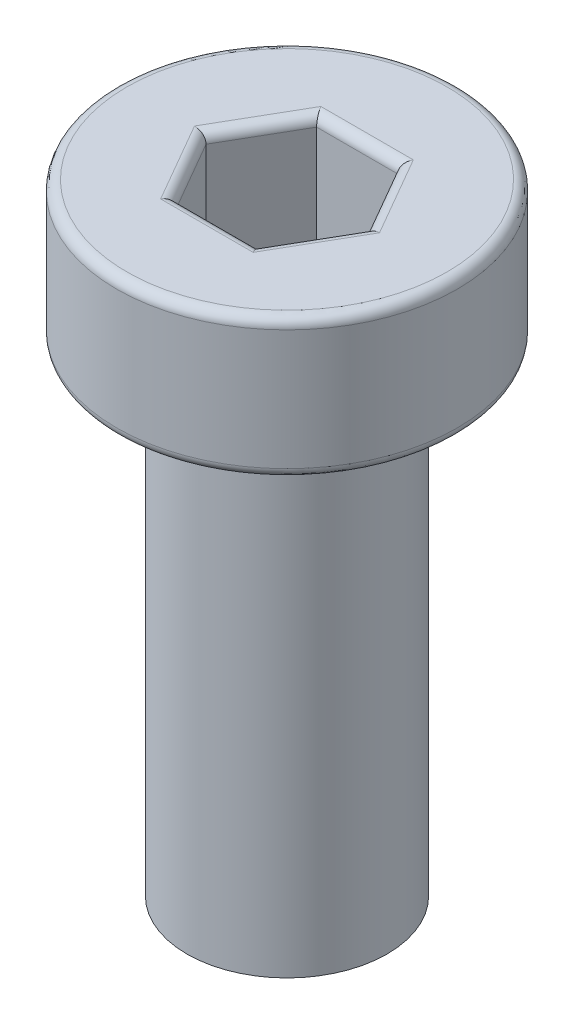
ISO-10303-21;
HEADER;
FILE_DESCRIPTION(('STEP AP214'),'2;1');
FILE_NAME('part.step','',(''),(''),'','','');
FILE_SCHEMA(('AUTOMOTIVE_DESIGN { 1 0 10303 214 1 1 1 1 }'));
ENDSEC;
DATA;
#1=APPLICATION_CONTEXT('core data for automotive mechanical design processes');
#2=APPLICATION_PROTOCOL_DEFINITION('international standard','automotive_design',2000,#1);
#3=PRODUCT_CONTEXT('',#1,'mechanical');
#4=PRODUCT('Part','Part','',(#3));
#5=PRODUCT_RELATED_PRODUCT_CATEGORY('part','',(#4));
#6=PRODUCT_DEFINITION_FORMATION('','',#4);
#7=PRODUCT_DEFINITION_CONTEXT('part definition',#1,'design');
#8=PRODUCT_DEFINITION('design','',#6,#7);
#9=PRODUCT_DEFINITION_SHAPE('','',#8);
#10=(LENGTH_UNIT() NAMED_UNIT(*) SI_UNIT(.MILLI.,.METRE.));
#11=(NAMED_UNIT(*) PLANE_ANGLE_UNIT() SI_UNIT($,.RADIAN.));
#12=(NAMED_UNIT(*) SI_UNIT($,.STERADIAN.) SOLID_ANGLE_UNIT());
#13=UNCERTAINTY_MEASURE_WITH_UNIT(LENGTH_MEASURE(1.E-05),#10,'distance_accuracy_value','');
#14=(GEOMETRIC_REPRESENTATION_CONTEXT(3) GLOBAL_UNCERTAINTY_ASSIGNED_CONTEXT((#13)) GLOBAL_UNIT_ASSIGNED_CONTEXT((#10,
#11,#12)) REPRESENTATION_CONTEXT('',''));
#15=CARTESIAN_POINT('',(0.,0.,0.));
#16=DIRECTION('',(0.,0.,1.));
#17=DIRECTION('',(1.,0.,0.));
#18=AXIS2_PLACEMENT_3D('',#15,#16,#17);
#19=CARTESIAN_POINT('',(2.45065328235741E-11,3.5,0.));
#20=DIRECTION('',(0.,-1.,0.));
#21=DIRECTION('',(1.,0.,0.));
#22=AXIS2_PLACEMENT_3D('',#19,#20,#21);
#23=PLANE('',#22);
#24=CARTESIAN_POINT('',(0.,3.5,0.));
#25=DIRECTION('',(0.,-1.,0.));
#26=DIRECTION('',(1.,0.,0.));
#27=AXIS2_PLACEMENT_3D('',#24,#25,#26);
#28=CIRCLE('',#27,4.0000000000245);
#29=CARTESIAN_POINT('',(4.0000000000245,3.5,0.));
#30=VERTEX_POINT('',#29);
#31=EDGE_CURVE('E179',#30,#30,#28,.F.);
#32=ORIENTED_EDGE('',*,*,#31,.T.);
#33=EDGE_LOOP('',(#32));
#34=FACE_BOUND('',#33,.T.);
#35=DIRECTION('',(-0.5,0.,0.866025403784439));
#36=VECTOR('',#35,1.);
#37=CARTESIAN_POINT('',(-1.73205080756275,3.5,-1.00000000001061));
#38=LINE('',#37,#36);
#39=CARTESIAN_POINT('',(-2.3094010767585,3.5,0.));
#40=VERTEX_POINT('',#39);
#41=CARTESIAN_POINT('',(-1.15470053837925,3.5,-2.));
#42=VERTEX_POINT('',#41);
#43=EDGE_CURVE('E174',#40,#42,#38,.F.);
#44=ORIENTED_EDGE('',*,*,#43,.T.);
#45=DIRECTION('',(-1.,0.,0.));
#46=VECTOR('',#45,1.);
#47=CARTESIAN_POINT('',(2.45071766726879E-11,3.5,-2.));
#48=LINE('',#47,#46);
#49=CARTESIAN_POINT('',(1.15470053837925,3.5,-2.));
#50=VERTEX_POINT('',#49);
#51=EDGE_CURVE('E176',#42,#50,#48,.F.);
#52=ORIENTED_EDGE('',*,*,#51,.T.);
#53=DIRECTION('',(-0.5,0.,-0.866025403784439));
#54=VECTOR('',#53,1.);
#55=CARTESIAN_POINT('',(1.732050807575,3.5,-0.999999999989388));
#56=LINE('',#55,#54);
#57=CARTESIAN_POINT('',(2.3094010767585,3.5,0.));
#58=VERTEX_POINT('',#57);
#59=EDGE_CURVE('E166',#50,#58,#56,.F.);
#60=ORIENTED_EDGE('',*,*,#59,.T.);
#61=DIRECTION('',(0.5,0.,-0.866025403784439));
#62=VECTOR('',#61,1.);
#63=CARTESIAN_POINT('',(1.732050807575,3.5,0.999999999989388));
#64=LINE('',#63,#62);
#65=CARTESIAN_POINT('',(1.15470053837925,3.5,2.));
#66=VERTEX_POINT('',#65);
#67=EDGE_CURVE('E168',#58,#66,#64,.F.);
#68=ORIENTED_EDGE('',*,*,#67,.T.);
#69=DIRECTION('',(1.,0.,0.));
#70=VECTOR('',#69,1.);
#71=CARTESIAN_POINT('',(2.45054597417179E-11,3.5,2.));
#72=LINE('',#71,#70);
#73=CARTESIAN_POINT('',(-1.15470053837925,3.5,2.));
#74=VERTEX_POINT('',#73);
#75=EDGE_CURVE('E170',#66,#74,#72,.F.);
#76=ORIENTED_EDGE('',*,*,#75,.T.);
#77=DIRECTION('',(0.5,0.,0.866025403784439));
#78=VECTOR('',#77,1.);
#79=CARTESIAN_POINT('',(-1.73205080756275,3.5,1.00000000001061));
#80=LINE('',#79,#78);
#81=EDGE_CURVE('E172',#74,#40,#80,.F.);
#82=ORIENTED_EDGE('',*,*,#81,.T.);
#83=EDGE_LOOP('',(#44,#52,#60,#68,#76,#82));
#84=FACE_BOUND('',#83,.T.);
#85=ADVANCED_FACE('F33',(#34,#84),#23,.F.);
#86=CARTESIAN_POINT('',(0.,21.3223243250921,0.));
#87=DIRECTION('',(0.,1.,0.));
#88=DIRECTION('',(-1.,0.,0.));
#89=AXIS2_PLACEMENT_3D('',#86,#87,#88);
#90=CYLINDRICAL_SURFACE('',#89,4.2500000000245);
#91=CARTESIAN_POINT('',(0.,0.25,0.));
#92=DIRECTION('',(0.,1.,0.));
#93=DIRECTION('',(-1.,0.,0.));
#94=AXIS2_PLACEMENT_3D('',#91,#92,#93);
#95=CIRCLE('',#94,4.2500000000245);
#96=CARTESIAN_POINT('',(-4.2500000000245,0.25,0.));
#97=VERTEX_POINT('',#96);
#98=EDGE_CURVE('E163',#97,#97,#95,.T.);
#99=ORIENTED_EDGE('',*,*,#98,.T.);
#100=EDGE_LOOP('',(#99));
#101=FACE_BOUND('',#100,.T.);
#102=CARTESIAN_POINT('',(0.,3.25,0.));
#103=DIRECTION('',(0.,-1.,0.));
#104=DIRECTION('',(1.,0.,0.));
#105=AXIS2_PLACEMENT_3D('',#102,#103,#104);
#106=CIRCLE('',#105,4.2500000000245);
#107=CARTESIAN_POINT('',(4.2500000000245,3.25,0.));
#108=VERTEX_POINT('',#107);
#109=EDGE_CURVE('E160',#108,#108,#106,.T.);
#110=ORIENTED_EDGE('',*,*,#109,.T.);
#111=EDGE_LOOP('',(#110));
#112=FACE_BOUND('',#111,.T.);
#113=ADVANCED_FACE('F240',(#101,#112),#90,.T.);
#114=CARTESIAN_POINT('',(4.2500000000245,0.,0.));
#115=DIRECTION('',(0.,1.,0.));
#116=DIRECTION('',(-1.,0.,0.));
#117=AXIS2_PLACEMENT_3D('',#114,#115,#116);
#118=PLANE('',#117);
#119=CARTESIAN_POINT('',(0.,0.,0.));
#120=DIRECTION('',(0.,1.,0.));
#121=DIRECTION('',(-1.,0.,0.));
#122=AXIS2_PLACEMENT_3D('',#119,#120,#121);
#123=CIRCLE('',#122,2.74999999997329);
#124=CARTESIAN_POINT('',(-2.74999999997329,0.,0.));
#125=VERTEX_POINT('',#124);
#126=EDGE_CURVE('E154',#125,#125,#123,.T.);
#127=ORIENTED_EDGE('',*,*,#126,.T.);
#128=EDGE_LOOP('',(#127));
#129=FACE_BOUND('',#128,.T.);
#130=CARTESIAN_POINT('',(0.,0.,0.));
#131=DIRECTION('',(0.,1.,0.));
#132=DIRECTION('',(-1.,0.,0.));
#133=AXIS2_PLACEMENT_3D('',#130,#131,#132);
#134=CIRCLE('',#133,4.0000000000245);
#135=CARTESIAN_POINT('',(-4.0000000000245,0.,0.));
#136=VERTEX_POINT('',#135);
#137=EDGE_CURVE('E151',#136,#136,#134,.F.);
#138=ORIENTED_EDGE('',*,*,#137,.T.);
#139=EDGE_LOOP('',(#138));
#140=FACE_BOUND('',#139,.T.);
#141=ADVANCED_FACE('F246',(#129,#140),#118,.F.);
#142=CARTESIAN_POINT('',(0.,21.3223243250921,0.));
#143=DIRECTION('',(0.,1.,0.));
#144=DIRECTION('',(-1.,0.,0.));
#145=AXIS2_PLACEMENT_3D('',#142,#143,#144);
#146=CYLINDRICAL_SURFACE('',#145,2.49999999997329);
#147=CARTESIAN_POINT('',(0.,-0.25,0.));
#148=DIRECTION('',(0.,1.,0.));
#149=DIRECTION('',(-1.,0.,0.));
#150=AXIS2_PLACEMENT_3D('',#147,#148,#149);
#151=CIRCLE('',#150,2.49999999997329);
#152=CARTESIAN_POINT('',(-2.49999999997329,-0.250000000000001,0.));
#153=VERTEX_POINT('',#152);
#154=EDGE_CURVE('E157',#153,#153,#151,.F.);
#155=ORIENTED_EDGE('',*,*,#154,.T.);
#156=EDGE_LOOP('',(#155));
#157=FACE_BOUND('',#156,.T.);
#158=CARTESIAN_POINT('',(0.,-12.,0.));
#159=DIRECTION('',(0.,1.,0.));
#160=DIRECTION('',(-1.,0.,0.));
#161=AXIS2_PLACEMENT_3D('',#158,#159,#160);
#162=CIRCLE('',#161,2.49999999997329);
#163=CARTESIAN_POINT('',(-2.49999999997329,-12.,0.));
#164=VERTEX_POINT('',#163);
#165=EDGE_CURVE('E139',#164,#164,#162,.T.);
#166=ORIENTED_EDGE('',*,*,#165,.T.);
#167=EDGE_LOOP('',(#166));
#168=FACE_BOUND('',#167,.T.);
#169=ADVANCED_FACE('F338',(#157,#168),#146,.T.);
#170=CARTESIAN_POINT('',(2.4999999999733,-12.,0.));
#171=DIRECTION('',(0.,1.,0.));
#172=DIRECTION('',(-1.,0.,0.));
#173=AXIS2_PLACEMENT_3D('',#170,#171,#172);
#174=PLANE('',#173);
#175=ORIENTED_EDGE('',*,*,#165,.F.);
#176=EDGE_LOOP('',(#175));
#177=FACE_BOUND('',#176,.T.);
#178=ADVANCED_FACE('F236',(#177),#174,.F.);
#179=CARTESIAN_POINT('',(1.01036297108184,0.5,1.75));
#180=DIRECTION('',(0.866025403784439,0.,0.5));
#181=DIRECTION('',(0.5,0.,-0.866025403784439));
#182=AXIS2_PLACEMENT_3D('',#179,#180,#181);
#183=PLANE('',#182);
#184=DIRECTION('',(0.,1.,0.));
#185=VECTOR('',#184,1.);
#186=CARTESIAN_POINT('',(1.01036297108184,0.5,1.75));
#187=LINE('',#186,#185);
#188=CARTESIAN_POINT('',(1.01036297108184,0.5,1.75));
#189=VERTEX_POINT('',#188);
#190=CARTESIAN_POINT('',(1.01036297108184,3.25,1.75));
#191=VERTEX_POINT('',#190);
#192=EDGE_CURVE('E137',#189,#191,#187,.T.);
#193=ORIENTED_EDGE('',*,*,#192,.T.);
#194=DIRECTION('',(0.5,0.,-0.866025403784439));
#195=VECTOR('',#194,1.);
#196=CARTESIAN_POINT('',(1.01036297108184,3.25,1.75));
#197=LINE('',#196,#195);
#198=CARTESIAN_POINT('',(2.02072594216369,3.25,0.));
#199=VERTEX_POINT('',#198);
#200=EDGE_CURVE('E42',#191,#199,#197,.T.);
#201=ORIENTED_EDGE('',*,*,#200,.T.);
#202=DIRECTION('',(0.,1.,0.));
#203=VECTOR('',#202,1.);
#204=CARTESIAN_POINT('',(2.02072594216369,0.5,0.));
#205=LINE('',#204,#203);
#206=CARTESIAN_POINT('',(2.02072594216369,0.5,0.));
#207=VERTEX_POINT('',#206);
#208=EDGE_CURVE('E103',#207,#199,#205,.T.);
#209=ORIENTED_EDGE('',*,*,#208,.F.);
#210=DIRECTION('',(0.5,0.,-0.866025403784439));
#211=VECTOR('',#210,1.);
#212=CARTESIAN_POINT('',(1.01036297108184,0.5,1.75));
#213=LINE('',#212,#211);
#214=EDGE_CURVE('E107',#189,#207,#213,.T.);
#215=ORIENTED_EDGE('',*,*,#214,.F.);
#216=EDGE_LOOP('',(#193,#201,#209,#215));
#217=FACE_BOUND('',#216,.T.);
#218=ADVANCED_FACE('F105',(#217),#183,.F.);
#219=CARTESIAN_POINT('',(-1.01036297108185,0.5,1.75));
#220=DIRECTION('',(0.,0.,1.));
#221=DIRECTION('',(1.,0.,0.));
#222=AXIS2_PLACEMENT_3D('',#219,#220,#221);
#223=PLANE('',#222);
#224=DIRECTION('',(0.,1.,0.));
#225=VECTOR('',#224,1.);
#226=CARTESIAN_POINT('',(-1.01036297108185,0.5,1.75));
#227=LINE('',#226,#225);
#228=CARTESIAN_POINT('',(-1.01036297108185,0.5,1.75));
#229=VERTEX_POINT('',#228);
#230=CARTESIAN_POINT('',(-1.01036297108185,3.25,1.75));
#231=VERTEX_POINT('',#230);
#232=EDGE_CURVE('E140',#229,#231,#227,.T.);
#233=ORIENTED_EDGE('',*,*,#232,.T.);
#234=DIRECTION('',(1.,0.,0.));
#235=VECTOR('',#234,1.);
#236=CARTESIAN_POINT('',(-1.01036297108185,3.25,1.75));
#237=LINE('',#236,#235);
#238=EDGE_CURVE('E57',#231,#191,#237,.T.);
#239=ORIENTED_EDGE('',*,*,#238,.T.);
#240=ORIENTED_EDGE('',*,*,#192,.F.);
#241=DIRECTION('',(1.,0.,0.));
#242=VECTOR('',#241,1.);
#243=CARTESIAN_POINT('',(-1.01036297108185,0.5,1.75));
#244=LINE('',#243,#242);
#245=EDGE_CURVE('E112',#229,#189,#244,.T.);
#246=ORIENTED_EDGE('',*,*,#245,.F.);
#247=EDGE_LOOP('',(#233,#239,#240,#246));
#248=FACE_BOUND('',#247,.T.);
#249=ADVANCED_FACE('F228',(#248),#223,.F.);
#250=CARTESIAN_POINT('',(-2.02072594216369,0.499999999999999,0.));
#251=DIRECTION('',(-0.866025403784439,0.,0.5));
#252=DIRECTION('',(0.5,0.,0.866025403784439));
#253=AXIS2_PLACEMENT_3D('',#250,#251,#252);
#254=PLANE('',#253);
#255=DIRECTION('',(0.,1.,0.));
#256=VECTOR('',#255,1.);
#257=CARTESIAN_POINT('',(-2.02072594216369,0.499999999999999,0.));
#258=LINE('',#257,#256);
#259=CARTESIAN_POINT('',(-2.02072594216369,0.499999999999999,0.));
#260=VERTEX_POINT('',#259);
#261=CARTESIAN_POINT('',(-2.02072594216369,3.25,0.));
#262=VERTEX_POINT('',#261);
#263=EDGE_CURVE('E142',#260,#262,#258,.T.);
#264=ORIENTED_EDGE('',*,*,#263,.T.);
#265=DIRECTION('',(0.5,0.,0.866025403784439));
#266=VECTOR('',#265,1.);
#267=CARTESIAN_POINT('',(-2.02072594216369,3.25,0.));
#268=LINE('',#267,#266);
#269=EDGE_CURVE('E187',#262,#231,#268,.T.);
#270=ORIENTED_EDGE('',*,*,#269,.T.);
#271=ORIENTED_EDGE('',*,*,#232,.F.);
#272=DIRECTION('',(0.5,0.,0.866025403784439));
#273=VECTOR('',#272,1.);
#274=CARTESIAN_POINT('',(-2.02072594216369,0.499999999999999,0.));
#275=LINE('',#274,#273);
#276=EDGE_CURVE('E134',#260,#229,#275,.T.);
#277=ORIENTED_EDGE('',*,*,#276,.F.);
#278=EDGE_LOOP('',(#264,#270,#271,#277));
#279=FACE_BOUND('',#278,.T.);
#280=ADVANCED_FACE('F227',(#279),#254,.F.);
#281=CARTESIAN_POINT('',(-1.01036297108185,0.5,-1.75));
#282=DIRECTION('',(-0.866025403784439,0.,-0.5));
#283=DIRECTION('',(-0.5,0.,0.866025403784439));
#284=AXIS2_PLACEMENT_3D('',#281,#282,#283);
#285=PLANE('',#284);
#286=DIRECTION('',(0.,1.,0.));
#287=VECTOR('',#286,1.);
#288=CARTESIAN_POINT('',(-1.01036297108185,0.5,-1.75));
#289=LINE('',#288,#287);
#290=CARTESIAN_POINT('',(-1.01036297108185,0.5,-1.75));
#291=VERTEX_POINT('',#290);
#292=CARTESIAN_POINT('',(-1.01036297108185,3.25,-1.75));
#293=VERTEX_POINT('',#292);
#294=EDGE_CURVE('E145',#291,#293,#289,.T.);
#295=ORIENTED_EDGE('',*,*,#294,.T.);
#296=DIRECTION('',(-0.5,0.,0.866025403784439));
#297=VECTOR('',#296,1.);
#298=CARTESIAN_POINT('',(-1.01036297108185,3.25,-1.75));
#299=LINE('',#298,#297);
#300=EDGE_CURVE('E185',#293,#262,#299,.T.);
#301=ORIENTED_EDGE('',*,*,#300,.T.);
#302=ORIENTED_EDGE('',*,*,#263,.F.);
#303=DIRECTION('',(-0.5,0.,0.866025403784439));
#304=VECTOR('',#303,1.);
#305=CARTESIAN_POINT('',(-1.01036297108185,0.5,-1.75));
#306=LINE('',#305,#304);
#307=EDGE_CURVE('E131',#291,#260,#306,.T.);
#308=ORIENTED_EDGE('',*,*,#307,.F.);
#309=EDGE_LOOP('',(#295,#301,#302,#308));
#310=FACE_BOUND('',#309,.T.);
#311=ADVANCED_FACE('F224',(#310),#285,.F.);
#312=CARTESIAN_POINT('',(1.01036297108185,0.5,-1.75));
#313=DIRECTION('',(0.,0.,-1.));
#314=DIRECTION('',(-1.,0.,0.));
#315=AXIS2_PLACEMENT_3D('',#312,#313,#314);
#316=PLANE('',#315);
#317=DIRECTION('',(0.,1.,0.));
#318=VECTOR('',#317,1.);
#319=CARTESIAN_POINT('',(1.01036297108185,0.5,-1.75));
#320=LINE('',#319,#318);
#321=CARTESIAN_POINT('',(1.01036297108185,0.5,-1.75));
#322=VERTEX_POINT('',#321);
#323=CARTESIAN_POINT('',(1.01036297108184,3.25,-1.75));
#324=VERTEX_POINT('',#323);
#325=EDGE_CURVE('E111',#322,#324,#320,.T.);
#326=ORIENTED_EDGE('',*,*,#325,.T.);
#327=DIRECTION('',(-1.,0.,0.));
#328=VECTOR('',#327,1.);
#329=CARTESIAN_POINT('',(1.01036297108184,3.25,-1.75));
#330=LINE('',#329,#328);
#331=EDGE_CURVE('E182',#324,#293,#330,.T.);
#332=ORIENTED_EDGE('',*,*,#331,.T.);
#333=ORIENTED_EDGE('',*,*,#294,.F.);
#334=DIRECTION('',(-1.,0.,0.));
#335=VECTOR('',#334,1.);
#336=CARTESIAN_POINT('',(1.01036297108185,0.5,-1.75));
#337=LINE('',#336,#335);
#338=EDGE_CURVE('E121',#322,#291,#337,.T.);
#339=ORIENTED_EDGE('',*,*,#338,.F.);
#340=EDGE_LOOP('',(#326,#332,#333,#339));
#341=FACE_BOUND('',#340,.T.);
#342=ADVANCED_FACE('F220',(#341),#316,.F.);
#343=CARTESIAN_POINT('',(2.02072594216369,0.5,0.));
#344=DIRECTION('',(0.866025403784439,0.,-0.5));
#345=DIRECTION('',(-0.5,0.,-0.866025403784439));
#346=AXIS2_PLACEMENT_3D('',#343,#344,#345);
#347=PLANE('',#346);
#348=ORIENTED_EDGE('',*,*,#208,.T.);
#349=DIRECTION('',(-0.5,0.,-0.866025403784439));
#350=VECTOR('',#349,1.);
#351=CARTESIAN_POINT('',(2.02072594216369,3.25,0.));
#352=LINE('',#351,#350);
#353=EDGE_CURVE('E11',#199,#324,#352,.T.);
#354=ORIENTED_EDGE('',*,*,#353,.T.);
#355=ORIENTED_EDGE('',*,*,#325,.F.);
#356=DIRECTION('',(-0.5,0.,-0.866025403784439));
#357=VECTOR('',#356,1.);
#358=CARTESIAN_POINT('',(2.02072594216369,0.5,0.));
#359=LINE('',#358,#357);
#360=EDGE_CURVE('E115',#207,#322,#359,.T.);
#361=ORIENTED_EDGE('',*,*,#360,.F.);
#362=EDGE_LOOP('',(#348,#354,#355,#361));
#363=FACE_BOUND('',#362,.T.);
#364=ADVANCED_FACE('F116',(#363),#347,.F.);
#365=CARTESIAN_POINT('',(0.,0.499999999999999,0.));
#366=DIRECTION('',(0.,1.,0.));
#367=DIRECTION('',(-1.,0.,0.));
#368=AXIS2_PLACEMENT_3D('',#365,#366,#367);
#369=PLANE('',#368);
#370=ORIENTED_EDGE('',*,*,#214,.T.);
#371=ORIENTED_EDGE('',*,*,#360,.T.);
#372=ORIENTED_EDGE('',*,*,#338,.T.);
#373=ORIENTED_EDGE('',*,*,#307,.T.);
#374=ORIENTED_EDGE('',*,*,#276,.T.);
#375=ORIENTED_EDGE('',*,*,#245,.T.);
#376=EDGE_LOOP('',(#370,#371,#372,#373,#374,#375));
#377=FACE_BOUND('',#376,.T.);
#378=ADVANCED_FACE('F123',(#377),#369,.T.);
#379=CARTESIAN_POINT('',(0.,-0.25,0.));
#380=DIRECTION('',(0.,1.,0.));
#381=DIRECTION('',(-1.,0.,0.));
#382=AXIS2_PLACEMENT_3D('',#379,#380,#381);
#383=TOROIDAL_SURFACE('',#382,2.74999999997329,0.25);
#384=ORIENTED_EDGE('',*,*,#154,.F.);
#385=EDGE_LOOP('',(#384));
#386=FACE_BOUND('',#385,.T.);
#387=ORIENTED_EDGE('',*,*,#126,.F.);
#388=EDGE_LOOP('',(#387));
#389=FACE_BOUND('',#388,.T.);
#390=ADVANCED_FACE('F252',(#386,#389),#383,.F.);
#391=CARTESIAN_POINT('',(0.,0.25,0.));
#392=DIRECTION('',(0.,1.,0.));
#393=DIRECTION('',(-1.,0.,0.));
#394=AXIS2_PLACEMENT_3D('',#391,#392,#393);
#395=TOROIDAL_SURFACE('',#394,4.0000000000245,0.25);
#396=ORIENTED_EDGE('',*,*,#137,.F.);
#397=EDGE_LOOP('',(#396));
#398=FACE_BOUND('',#397,.T.);
#399=ORIENTED_EDGE('',*,*,#98,.F.);
#400=EDGE_LOOP('',(#399));
#401=FACE_BOUND('',#400,.T.);
#402=ADVANCED_FACE('F255',(#398,#401),#395,.T.);
#403=CARTESIAN_POINT('',(0.,3.25,0.));
#404=DIRECTION('',(0.,-1.,0.));
#405=DIRECTION('',(1.,0.,0.));
#406=AXIS2_PLACEMENT_3D('',#403,#404,#405);
#407=TOROIDAL_SURFACE('',#406,4.0000000000245,0.25);
#408=ORIENTED_EDGE('',*,*,#109,.F.);
#409=EDGE_LOOP('',(#408));
#410=FACE_BOUND('',#409,.T.);
#411=ORIENTED_EDGE('',*,*,#31,.F.);
#412=EDGE_LOOP('',(#411));
#413=FACE_BOUND('',#412,.T.);
#414=ADVANCED_FACE('F259',(#410,#413),#407,.T.);
#415=CARTESIAN_POINT('',(-1.01036297108185,3.25,2.));
#416=DIRECTION('',(1.,0.,0.));
#417=DIRECTION('',(0.,0.,-1.));
#418=AXIS2_PLACEMENT_3D('',#415,#416,#417);
#419=CYLINDRICAL_SURFACE('',#418,0.25);
#420=CARTESIAN_POINT('',(-1.15470053837925,3.25,2.));
#421=DIRECTION('',(0.866025403784438,0.,0.500000000000001));
#422=DIRECTION('',(-0.5,0.,0.866025403784438));
#423=AXIS2_PLACEMENT_3D('',#420,#421,#422);
#424=ELLIPSE('',#423,0.288675134594813,0.25);
#425=EDGE_CURVE('E128',#74,#231,#424,.F.);
#426=ORIENTED_EDGE('',*,*,#425,.F.);
#427=ORIENTED_EDGE('',*,*,#75,.F.);
#428=CARTESIAN_POINT('',(1.15470053837925,3.25,2.));
#429=DIRECTION('',(0.866025403784439,0.,-0.5));
#430=DIRECTION('',(0.5,0.,0.866025403784439));
#431=AXIS2_PLACEMENT_3D('',#428,#429,#430);
#432=ELLIPSE('',#431,0.288675134594813,0.25);
#433=EDGE_CURVE('E37',#191,#66,#432,.T.);
#434=ORIENTED_EDGE('',*,*,#433,.F.);
#435=ORIENTED_EDGE('',*,*,#238,.F.);
#436=EDGE_LOOP('',(#426,#427,#434,#435));
#437=FACE_BOUND('',#436,.T.);
#438=ADVANCED_FACE('F35',(#437),#419,.T.);
#439=CARTESIAN_POINT('',(1.22686932202795,3.25,1.875));
#440=DIRECTION('',(0.5,0.,-0.866025403784439));
#441=DIRECTION('',(-0.866025403784439,0.,-0.5));
#442=AXIS2_PLACEMENT_3D('',#439,#440,#441);
#443=CYLINDRICAL_SURFACE('',#442,0.25);
#444=ORIENTED_EDGE('',*,*,#433,.T.);
#445=ORIENTED_EDGE('',*,*,#67,.F.);
#446=CARTESIAN_POINT('',(2.3094010767585,3.25,0.));
#447=DIRECTION('',(0.,0.,-1.));
#448=DIRECTION('',(1.,0.,0.));
#449=AXIS2_PLACEMENT_3D('',#446,#447,#448);
#450=ELLIPSE('',#449,0.288675134594813,0.25);
#451=EDGE_CURVE('E198',#199,#58,#450,.T.);
#452=ORIENTED_EDGE('',*,*,#451,.F.);
#453=ORIENTED_EDGE('',*,*,#200,.F.);
#454=EDGE_LOOP('',(#444,#445,#452,#453));
#455=FACE_BOUND('',#454,.T.);
#456=ADVANCED_FACE('F212',(#455),#443,.T.);
#457=CARTESIAN_POINT('',(-2.2372322931098,3.25,0.124999999999999));
#458=DIRECTION('',(0.5,0.,0.866025403784439));
#459=DIRECTION('',(0.866025403784439,0.,-0.5));
#460=AXIS2_PLACEMENT_3D('',#457,#458,#459);
#461=CYLINDRICAL_SURFACE('',#460,0.25);
#462=ORIENTED_EDGE('',*,*,#425,.T.);
#463=ORIENTED_EDGE('',*,*,#269,.F.);
#464=CARTESIAN_POINT('',(-2.3094010767585,3.25,0.));
#465=DIRECTION('',(0.,0.,1.));
#466=DIRECTION('',(-1.,0.,0.));
#467=AXIS2_PLACEMENT_3D('',#464,#465,#466);
#468=ELLIPSE('',#467,0.288675134594813,0.25);
#469=EDGE_CURVE('E195',#40,#262,#468,.F.);
#470=ORIENTED_EDGE('',*,*,#469,.F.);
#471=ORIENTED_EDGE('',*,*,#81,.F.);
#472=EDGE_LOOP('',(#462,#463,#470,#471));
#473=FACE_BOUND('',#472,.T.);
#474=ADVANCED_FACE('F205',(#473),#461,.T.);
#475=CARTESIAN_POINT('',(2.2372322931098,3.25,-0.125));
#476=DIRECTION('',(-0.5,0.,-0.866025403784439));
#477=DIRECTION('',(-0.866025403784439,0.,0.5));
#478=AXIS2_PLACEMENT_3D('',#475,#476,#477);
#479=CYLINDRICAL_SURFACE('',#478,0.25);
#480=ORIENTED_EDGE('',*,*,#451,.T.);
#481=ORIENTED_EDGE('',*,*,#59,.F.);
#482=CARTESIAN_POINT('',(1.15470053837925,3.25,-2.));
#483=DIRECTION('',(-0.866025403784438,0.,-0.5));
#484=DIRECTION('',(-0.5,0.,0.866025403784439));
#485=AXIS2_PLACEMENT_3D('',#482,#483,#484);
#486=ELLIPSE('',#485,0.288675134594813,0.25);
#487=EDGE_CURVE('E193',#324,#50,#486,.T.);
#488=ORIENTED_EDGE('',*,*,#487,.F.);
#489=ORIENTED_EDGE('',*,*,#353,.F.);
#490=EDGE_LOOP('',(#480,#481,#488,#489));
#491=FACE_BOUND('',#490,.T.);
#492=ADVANCED_FACE('F217',(#491),#479,.T.);
#493=CARTESIAN_POINT('',(-1.22686932202796,3.25,-1.875));
#494=DIRECTION('',(-0.5,0.,0.866025403784439));
#495=DIRECTION('',(0.866025403784439,0.,0.5));
#496=AXIS2_PLACEMENT_3D('',#493,#494,#495);
#497=CYLINDRICAL_SURFACE('',#496,0.25);
#498=ORIENTED_EDGE('',*,*,#469,.T.);
#499=ORIENTED_EDGE('',*,*,#300,.F.);
#500=CARTESIAN_POINT('',(-1.15470053837925,3.25,-2.));
#501=DIRECTION('',(-0.866025403784439,0.,0.5));
#502=DIRECTION('',(-0.5,0.,-0.866025403784439));
#503=AXIS2_PLACEMENT_3D('',#500,#501,#502);
#504=ELLIPSE('',#503,0.288675134594813,0.25);
#505=EDGE_CURVE('E191',#42,#293,#504,.F.);
#506=ORIENTED_EDGE('',*,*,#505,.F.);
#507=ORIENTED_EDGE('',*,*,#43,.F.);
#508=EDGE_LOOP('',(#498,#499,#506,#507));
#509=FACE_BOUND('',#508,.T.);
#510=ADVANCED_FACE('F267',(#509),#497,.T.);
#511=CARTESIAN_POINT('',(1.01036297108184,3.25,-2.));
#512=DIRECTION('',(-1.,0.,0.));
#513=DIRECTION('',(0.,0.,1.));
#514=AXIS2_PLACEMENT_3D('',#511,#512,#513);
#515=CYLINDRICAL_SURFACE('',#514,0.25);
#516=ORIENTED_EDGE('',*,*,#487,.T.);
#517=ORIENTED_EDGE('',*,*,#51,.F.);
#518=ORIENTED_EDGE('',*,*,#505,.T.);
#519=ORIENTED_EDGE('',*,*,#331,.F.);
#520=EDGE_LOOP('',(#516,#517,#518,#519));
#521=FACE_BOUND('',#520,.T.);
#522=ADVANCED_FACE('F264',(#521),#515,.T.);
#523=CLOSED_SHELL('',(#85,#113,#141,#169,#178,#218,#249,#280,#311,#342,#364,#378,#390,#402,#414,
#438,#456,#474,#492,#510,#522));
#524=MANIFOLD_SOLID_BREP('B2',#523);
#525=ADVANCED_BREP_SHAPE_REPRESENTATION('',(#18,#524),#14);
#526=SHAPE_DEFINITION_REPRESENTATION(#9,#525);
ENDSEC;
END-ISO-10303-21;
